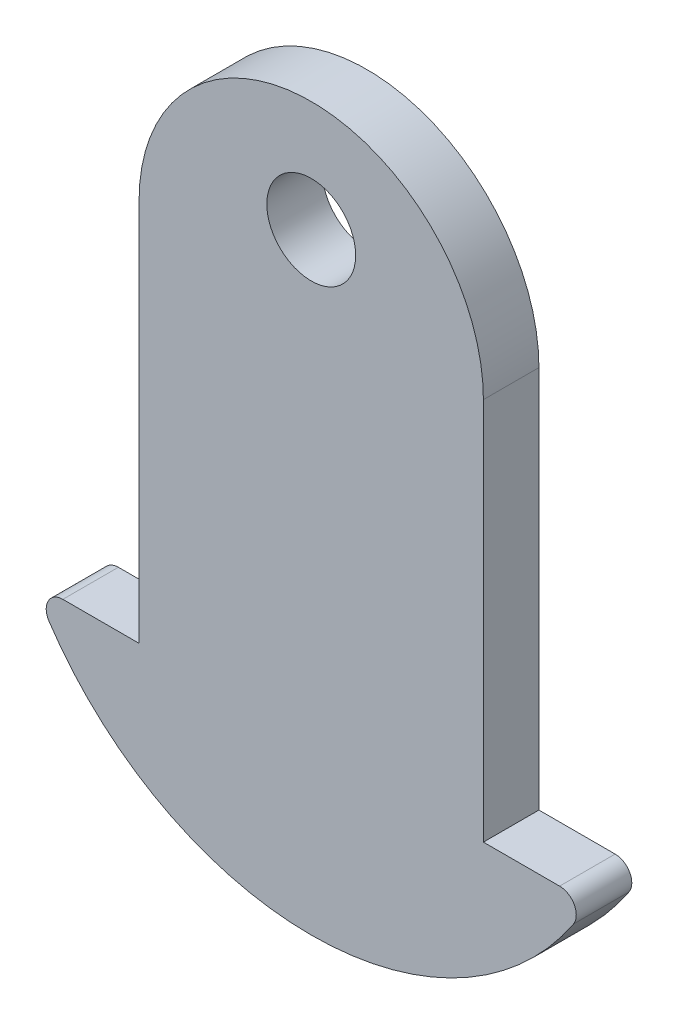
ISO-10303-21;
HEADER;
FILE_DESCRIPTION(('STEP AP214'),'2;1');
FILE_NAME('part.step','',(''),(''),'','','');
FILE_SCHEMA(('AUTOMOTIVE_DESIGN { 1 0 10303 214 1 1 1 1 }'));
ENDSEC;
DATA;
#1=APPLICATION_CONTEXT('core data for automotive mechanical design processes');
#2=APPLICATION_PROTOCOL_DEFINITION('international standard','automotive_design',2000,#1);
#3=PRODUCT_CONTEXT('',#1,'mechanical');
#4=PRODUCT('Part','Part','',(#3));
#5=PRODUCT_RELATED_PRODUCT_CATEGORY('part','',(#4));
#6=PRODUCT_DEFINITION_FORMATION('','',#4);
#7=PRODUCT_DEFINITION_CONTEXT('part definition',#1,'design');
#8=PRODUCT_DEFINITION('design','',#6,#7);
#9=PRODUCT_DEFINITION_SHAPE('','',#8);
#10=(LENGTH_UNIT() NAMED_UNIT(*) SI_UNIT(.MILLI.,.METRE.));
#11=(NAMED_UNIT(*) PLANE_ANGLE_UNIT() SI_UNIT($,.RADIAN.));
#12=(NAMED_UNIT(*) SI_UNIT($,.STERADIAN.) SOLID_ANGLE_UNIT());
#13=UNCERTAINTY_MEASURE_WITH_UNIT(LENGTH_MEASURE(1.E-05),#10,'distance_accuracy_value','');
#14=(GEOMETRIC_REPRESENTATION_CONTEXT(3) GLOBAL_UNCERTAINTY_ASSIGNED_CONTEXT((#13)) GLOBAL_UNIT_ASSIGNED_CONTEXT((#10,
#11,#12)) REPRESENTATION_CONTEXT('',''));
#15=CARTESIAN_POINT('',(0.,0.,0.));
#16=DIRECTION('',(0.,0.,1.));
#17=DIRECTION('',(1.,0.,0.));
#18=AXIS2_PLACEMENT_3D('',#15,#16,#17);
#19=CARTESIAN_POINT('',(0.,17.25,1.25));
#20=DIRECTION('',(0.,0.,1.));
#21=DIRECTION('',(1.,0.,0.));
#22=AXIS2_PLACEMENT_3D('',#19,#20,#21);
#23=PLANE('',#22);
#24=DIRECTION('',(-1.,0.,0.));
#25=VECTOR('',#24,1.);
#26=CARTESIAN_POINT('',(-7.75,0.,1.25));
#27=LINE('',#26,#25);
#28=CARTESIAN_POINT('',(-7.75,0.,1.25));
#29=VERTEX_POINT('',#28);
#30=CARTESIAN_POINT('',(-11.1803398874989,0.,1.25));
#31=VERTEX_POINT('',#30);
#32=EDGE_CURVE('E108',#29,#31,#27,.T.);
#33=ORIENTED_EDGE('',*,*,#32,.T.);
#34=CARTESIAN_POINT('',(-11.1803398874989,-0.75,1.25));
#35=DIRECTION('',(0.,0.,1.));
#36=DIRECTION('',(1.,0.,0.));
#37=AXIS2_PLACEMENT_3D('',#34,#35,#36);
#38=CIRCLE('',#37,0.75);
#39=CARTESIAN_POINT('',(-11.8053278315206,-1.16459627329193,1.25));
#40=VERTEX_POINT('',#39);
#41=EDGE_CURVE('E40',#31,#40,#38,.T.);
#42=ORIENTED_EDGE('',*,*,#41,.T.);
#43=CARTESIAN_POINT('',(0.,6.66666666666667,1.25));
#44=DIRECTION('',(0.,0.,1.));
#45=DIRECTION('',(-1.,0.,0.));
#46=AXIS2_PLACEMENT_3D('',#43,#44,#45);
#47=CIRCLE('',#46,14.1666666666667);
#48=CARTESIAN_POINT('',(11.8053278315206,-1.16459627329193,1.25));
#49=VERTEX_POINT('',#48);
#50=EDGE_CURVE('E140',#40,#49,#47,.T.);
#51=ORIENTED_EDGE('',*,*,#50,.T.);
#52=CARTESIAN_POINT('',(11.1803398874989,-0.75,1.25));
#53=DIRECTION('',(0.,0.,1.));
#54=DIRECTION('',(1.,0.,0.));
#55=AXIS2_PLACEMENT_3D('',#52,#53,#54);
#56=CIRCLE('',#55,0.75);
#57=CARTESIAN_POINT('',(11.1803398874989,0.,1.25));
#58=VERTEX_POINT('',#57);
#59=EDGE_CURVE('E47',#49,#58,#56,.T.);
#60=ORIENTED_EDGE('',*,*,#59,.T.);
#61=DIRECTION('',(-1.,0.,0.));
#62=VECTOR('',#61,1.);
#63=CARTESIAN_POINT('',(7.75,0.,1.25));
#64=LINE('',#63,#62);
#65=CARTESIAN_POINT('',(7.75,0.,1.25));
#66=VERTEX_POINT('',#65);
#67=EDGE_CURVE('E148',#58,#66,#64,.T.);
#68=ORIENTED_EDGE('',*,*,#67,.T.);
#69=DIRECTION('',(0.,1.,0.));
#70=VECTOR('',#69,1.);
#71=CARTESIAN_POINT('',(7.75,17.25,1.25));
#72=LINE('',#71,#70);
#73=CARTESIAN_POINT('',(7.75,17.25,1.25));
#74=VERTEX_POINT('',#73);
#75=EDGE_CURVE('E114',#66,#74,#72,.T.);
#76=ORIENTED_EDGE('',*,*,#75,.T.);
#77=CARTESIAN_POINT('',(0.,17.25,1.25));
#78=DIRECTION('',(0.,0.,1.));
#79=DIRECTION('',(1.,0.,0.));
#80=AXIS2_PLACEMENT_3D('',#77,#78,#79);
#81=CIRCLE('',#80,7.75);
#82=CARTESIAN_POINT('',(-7.75,17.25,1.25));
#83=VERTEX_POINT('',#82);
#84=EDGE_CURVE('E109',#74,#83,#81,.T.);
#85=ORIENTED_EDGE('',*,*,#84,.T.);
#86=DIRECTION('',(0.,-1.,0.));
#87=VECTOR('',#86,1.);
#88=CARTESIAN_POINT('',(-7.75,17.25,1.25));
#89=LINE('',#88,#87);
#90=EDGE_CURVE('E100',#83,#29,#89,.T.);
#91=ORIENTED_EDGE('',*,*,#90,.T.);
#92=EDGE_LOOP('',(#33,#42,#51,#60,#68,#76,#85,#91));
#93=FACE_BOUND('',#92,.T.);
#94=CARTESIAN_POINT('',(0.,20.,1.25));
#95=DIRECTION('',(0.,0.,1.));
#96=DIRECTION('',(1.,0.,0.));
#97=AXIS2_PLACEMENT_3D('',#94,#95,#96);
#98=CIRCLE('',#97,2.);
#99=CARTESIAN_POINT('',(2.,20.,1.25));
#100=VERTEX_POINT('',#99);
#101=EDGE_CURVE('E175',#100,#100,#98,.T.);
#102=ORIENTED_EDGE('',*,*,#101,.F.);
#103=EDGE_LOOP('',(#102));
#104=FACE_BOUND('',#103,.T.);
#105=ADVANCED_FACE('F32',(#93,#104),#23,.T.);
#106=CARTESIAN_POINT('',(0.,17.25,-1.25));
#107=DIRECTION('',(0.,0.,1.));
#108=DIRECTION('',(1.,0.,0.));
#109=AXIS2_PLACEMENT_3D('',#106,#107,#108);
#110=PLANE('',#109);
#111=CARTESIAN_POINT('',(0.,6.66666666666667,-1.25));
#112=DIRECTION('',(0.,0.,1.));
#113=DIRECTION('',(-1.,0.,0.));
#114=AXIS2_PLACEMENT_3D('',#111,#112,#113);
#115=CIRCLE('',#114,14.1666666666667);
#116=CARTESIAN_POINT('',(-11.8053278315206,-1.16459627329193,-1.25));
#117=VERTEX_POINT('',#116);
#118=CARTESIAN_POINT('',(11.8053278315206,-1.16459627329193,-1.25));
#119=VERTEX_POINT('',#118);
#120=EDGE_CURVE('E156',#117,#119,#115,.T.);
#121=ORIENTED_EDGE('',*,*,#120,.F.);
#122=CARTESIAN_POINT('',(-11.1803398874989,-0.75,-1.25));
#123=DIRECTION('',(0.,0.,1.));
#124=DIRECTION('',(1.,0.,0.));
#125=AXIS2_PLACEMENT_3D('',#122,#123,#124);
#126=CIRCLE('',#125,0.75);
#127=CARTESIAN_POINT('',(-11.1803398874989,0.,-1.25));
#128=VERTEX_POINT('',#127);
#129=EDGE_CURVE('E135',#117,#128,#126,.F.);
#130=ORIENTED_EDGE('',*,*,#129,.T.);
#131=DIRECTION('',(-1.,0.,0.));
#132=VECTOR('',#131,1.);
#133=CARTESIAN_POINT('',(-7.75,0.,-1.25));
#134=LINE('',#133,#132);
#135=CARTESIAN_POINT('',(-7.75,0.,-1.25));
#136=VERTEX_POINT('',#135);
#137=EDGE_CURVE('E155',#136,#128,#134,.T.);
#138=ORIENTED_EDGE('',*,*,#137,.F.);
#139=DIRECTION('',(0.,-1.,0.));
#140=VECTOR('',#139,1.);
#141=CARTESIAN_POINT('',(-7.75,17.25,-1.25));
#142=LINE('',#141,#140);
#143=CARTESIAN_POINT('',(-7.75,17.25,-1.25));
#144=VERTEX_POINT('',#143);
#145=EDGE_CURVE('E158',#144,#136,#142,.T.);
#146=ORIENTED_EDGE('',*,*,#145,.F.);
#147=CARTESIAN_POINT('',(0.,17.25,-1.25));
#148=DIRECTION('',(0.,0.,1.));
#149=DIRECTION('',(1.,0.,0.));
#150=AXIS2_PLACEMENT_3D('',#147,#148,#149);
#151=CIRCLE('',#150,7.75);
#152=CARTESIAN_POINT('',(7.75,17.25,-1.25));
#153=VERTEX_POINT('',#152);
#154=EDGE_CURVE('E122',#153,#144,#151,.T.);
#155=ORIENTED_EDGE('',*,*,#154,.F.);
#156=DIRECTION('',(0.,1.,0.));
#157=VECTOR('',#156,1.);
#158=CARTESIAN_POINT('',(7.75,17.25,-1.25));
#159=LINE('',#158,#157);
#160=CARTESIAN_POINT('',(7.75,0.,-1.25));
#161=VERTEX_POINT('',#160);
#162=EDGE_CURVE('E118',#161,#153,#159,.T.);
#163=ORIENTED_EDGE('',*,*,#162,.F.);
#164=DIRECTION('',(-1.,0.,0.));
#165=VECTOR('',#164,1.);
#166=CARTESIAN_POINT('',(7.75,0.,-1.25));
#167=LINE('',#166,#165);
#168=CARTESIAN_POINT('',(11.1803398874989,0.,-1.25));
#169=VERTEX_POINT('',#168);
#170=EDGE_CURVE('E160',#169,#161,#167,.T.);
#171=ORIENTED_EDGE('',*,*,#170,.F.);
#172=CARTESIAN_POINT('',(11.1803398874989,-0.75,-1.25));
#173=DIRECTION('',(0.,0.,1.));
#174=DIRECTION('',(1.,0.,0.));
#175=AXIS2_PLACEMENT_3D('',#172,#173,#174);
#176=CIRCLE('',#175,0.75);
#177=EDGE_CURVE('E133',#169,#119,#176,.F.);
#178=ORIENTED_EDGE('',*,*,#177,.T.);
#179=EDGE_LOOP('',(#121,#130,#138,#146,#155,#163,#171,#178));
#180=FACE_BOUND('',#179,.T.);
#181=CARTESIAN_POINT('',(0.,20.,-1.25));
#182=DIRECTION('',(0.,0.,1.));
#183=DIRECTION('',(1.,0.,0.));
#184=AXIS2_PLACEMENT_3D('',#181,#182,#183);
#185=CIRCLE('',#184,2.);
#186=CARTESIAN_POINT('',(2.,20.,-1.25));
#187=VERTEX_POINT('',#186);
#188=EDGE_CURVE('E177',#187,#187,#185,.T.);
#189=ORIENTED_EDGE('',*,*,#188,.T.);
#190=EDGE_LOOP('',(#189));
#191=FACE_BOUND('',#190,.T.);
#192=ADVANCED_FACE('F153',(#180,#191),#110,.F.);
#193=CARTESIAN_POINT('',(0.,17.25,1.25));
#194=DIRECTION('',(0.,0.,-1.));
#195=DIRECTION('',(-1.,0.,0.));
#196=AXIS2_PLACEMENT_3D('',#193,#194,#195);
#197=CYLINDRICAL_SURFACE('',#196,7.75);
#198=ORIENTED_EDGE('',*,*,#154,.T.);
#199=DIRECTION('',(0.,0.,-1.));
#200=VECTOR('',#199,1.);
#201=CARTESIAN_POINT('',(-7.75,17.25,1.25));
#202=LINE('',#201,#200);
#203=EDGE_CURVE('E104',#83,#144,#202,.T.);
#204=ORIENTED_EDGE('',*,*,#203,.F.);
#205=ORIENTED_EDGE('',*,*,#84,.F.);
#206=DIRECTION('',(0.,0.,-1.));
#207=VECTOR('',#206,1.);
#208=CARTESIAN_POINT('',(7.75,17.25,1.25));
#209=LINE('',#208,#207);
#210=EDGE_CURVE('E167',#74,#153,#209,.T.);
#211=ORIENTED_EDGE('',*,*,#210,.T.);
#212=EDGE_LOOP('',(#198,#204,#205,#211));
#213=FACE_BOUND('',#212,.T.);
#214=ADVANCED_FACE('F120',(#213),#197,.T.);
#215=CARTESIAN_POINT('',(-7.75,17.25,1.25));
#216=DIRECTION('',(1.,0.,0.));
#217=DIRECTION('',(0.,1.,0.));
#218=AXIS2_PLACEMENT_3D('',#215,#216,#217);
#219=PLANE('',#218);
#220=ORIENTED_EDGE('',*,*,#145,.T.);
#221=DIRECTION('',(0.,0.,-1.));
#222=VECTOR('',#221,1.);
#223=CARTESIAN_POINT('',(-7.75,0.,1.25));
#224=LINE('',#223,#222);
#225=EDGE_CURVE('E107',#29,#136,#224,.T.);
#226=ORIENTED_EDGE('',*,*,#225,.F.);
#227=ORIENTED_EDGE('',*,*,#90,.F.);
#228=ORIENTED_EDGE('',*,*,#203,.T.);
#229=EDGE_LOOP('',(#220,#226,#227,#228));
#230=FACE_BOUND('',#229,.T.);
#231=ADVANCED_FACE('F102',(#230),#219,.F.);
#232=CARTESIAN_POINT('',(-7.75,0.,1.25));
#233=DIRECTION('',(0.,-1.,0.));
#234=DIRECTION('',(1.,0.,0.));
#235=AXIS2_PLACEMENT_3D('',#232,#233,#234);
#236=PLANE('',#235);
#237=ORIENTED_EDGE('',*,*,#137,.T.);
#238=DIRECTION('',(0.,0.,-1.));
#239=VECTOR('',#238,1.);
#240=CARTESIAN_POINT('',(-11.1803398874989,0.,1.25));
#241=LINE('',#240,#239);
#242=EDGE_CURVE('E55',#128,#31,#241,.F.);
#243=ORIENTED_EDGE('',*,*,#242,.T.);
#244=ORIENTED_EDGE('',*,*,#32,.F.);
#245=ORIENTED_EDGE('',*,*,#225,.T.);
#246=EDGE_LOOP('',(#237,#243,#244,#245));
#247=FACE_BOUND('',#246,.T.);
#248=ADVANCED_FACE('F157',(#247),#236,.F.);
#249=CARTESIAN_POINT('',(0.,6.66666666666667,1.25));
#250=DIRECTION('',(0.,0.,-1.));
#251=DIRECTION('',(-1.,0.,0.));
#252=AXIS2_PLACEMENT_3D('',#249,#250,#251);
#253=CYLINDRICAL_SURFACE('',#252,14.1666666666667);
#254=ORIENTED_EDGE('',*,*,#50,.F.);
#255=DIRECTION('',(0.,0.,-1.));
#256=VECTOR('',#255,1.);
#257=CARTESIAN_POINT('',(-11.8053278315206,-1.16459627329193,1.25));
#258=LINE('',#257,#256);
#259=EDGE_CURVE('E125',#40,#117,#258,.T.);
#260=ORIENTED_EDGE('',*,*,#259,.T.);
#261=ORIENTED_EDGE('',*,*,#120,.T.);
#262=DIRECTION('',(0.,0.,-1.));
#263=VECTOR('',#262,1.);
#264=CARTESIAN_POINT('',(11.8053278315206,-1.16459627329193,1.25));
#265=LINE('',#264,#263);
#266=EDGE_CURVE('E123',#119,#49,#265,.F.);
#267=ORIENTED_EDGE('',*,*,#266,.T.);
#268=EDGE_LOOP('',(#254,#260,#261,#267));
#269=FACE_BOUND('',#268,.T.);
#270=ADVANCED_FACE('F144',(#269),#253,.T.);
#271=CARTESIAN_POINT('',(7.75,0.,1.25));
#272=DIRECTION('',(0.,-1.,0.));
#273=DIRECTION('',(1.,0.,0.));
#274=AXIS2_PLACEMENT_3D('',#271,#272,#273);
#275=PLANE('',#274);
#276=ORIENTED_EDGE('',*,*,#67,.F.);
#277=DIRECTION('',(0.,0.,-1.));
#278=VECTOR('',#277,1.);
#279=CARTESIAN_POINT('',(11.1803398874989,0.,1.25));
#280=LINE('',#279,#278);
#281=EDGE_CURVE('E11',#58,#169,#280,.T.);
#282=ORIENTED_EDGE('',*,*,#281,.T.);
#283=ORIENTED_EDGE('',*,*,#170,.T.);
#284=DIRECTION('',(0.,0.,-1.));
#285=VECTOR('',#284,1.);
#286=CARTESIAN_POINT('',(7.75,0.,1.25));
#287=LINE('',#286,#285);
#288=EDGE_CURVE('E127',#66,#161,#287,.T.);
#289=ORIENTED_EDGE('',*,*,#288,.F.);
#290=EDGE_LOOP('',(#276,#282,#283,#289));
#291=FACE_BOUND('',#290,.T.);
#292=ADVANCED_FACE('F194',(#291),#275,.F.);
#293=CARTESIAN_POINT('',(7.75,17.25,1.25));
#294=DIRECTION('',(-1.,0.,0.));
#295=DIRECTION('',(0.,-1.,0.));
#296=AXIS2_PLACEMENT_3D('',#293,#294,#295);
#297=PLANE('',#296);
#298=ORIENTED_EDGE('',*,*,#162,.T.);
#299=ORIENTED_EDGE('',*,*,#210,.F.);
#300=ORIENTED_EDGE('',*,*,#75,.F.);
#301=ORIENTED_EDGE('',*,*,#288,.T.);
#302=EDGE_LOOP('',(#298,#299,#300,#301));
#303=FACE_BOUND('',#302,.T.);
#304=ADVANCED_FACE('F172',(#303),#297,.F.);
#305=CARTESIAN_POINT('',(0.,20.,1.25));
#306=DIRECTION('',(0.,0.,-1.));
#307=DIRECTION('',(-1.,0.,0.));
#308=AXIS2_PLACEMENT_3D('',#305,#306,#307);
#309=CYLINDRICAL_SURFACE('',#308,2.);
#310=ORIENTED_EDGE('',*,*,#101,.T.);
#311=EDGE_LOOP('',(#310));
#312=FACE_BOUND('',#311,.T.);
#313=ORIENTED_EDGE('',*,*,#188,.F.);
#314=EDGE_LOOP('',(#313));
#315=FACE_BOUND('',#314,.T.);
#316=ADVANCED_FACE('F186',(#312,#315),#309,.F.);
#317=CARTESIAN_POINT('',(-11.1803398874989,-0.75,1.25));
#318=DIRECTION('',(0.,0.,-1.));
#319=DIRECTION('',(-1.,0.,0.));
#320=AXIS2_PLACEMENT_3D('',#317,#318,#319);
#321=CYLINDRICAL_SURFACE('',#320,0.75);
#322=ORIENTED_EDGE('',*,*,#41,.F.);
#323=ORIENTED_EDGE('',*,*,#242,.F.);
#324=ORIENTED_EDGE('',*,*,#129,.F.);
#325=ORIENTED_EDGE('',*,*,#259,.F.);
#326=EDGE_LOOP('',(#322,#323,#324,#325));
#327=FACE_BOUND('',#326,.T.);
#328=ADVANCED_FACE('F150',(#327),#321,.T.);
#329=CARTESIAN_POINT('',(11.1803398874989,-0.75,1.25));
#330=DIRECTION('',(0.,0.,-1.));
#331=DIRECTION('',(-1.,0.,0.));
#332=AXIS2_PLACEMENT_3D('',#329,#330,#331);
#333=CYLINDRICAL_SURFACE('',#332,0.75);
#334=ORIENTED_EDGE('',*,*,#59,.F.);
#335=ORIENTED_EDGE('',*,*,#266,.F.);
#336=ORIENTED_EDGE('',*,*,#177,.F.);
#337=ORIENTED_EDGE('',*,*,#281,.F.);
#338=EDGE_LOOP('',(#334,#335,#336,#337));
#339=FACE_BOUND('',#338,.T.);
#340=ADVANCED_FACE('F34',(#339),#333,.T.);
#341=CLOSED_SHELL('',(#105,#192,#214,#231,#248,#270,#292,#304,#316,#328,#340));
#342=MANIFOLD_SOLID_BREP('B2',#341);
#343=ADVANCED_BREP_SHAPE_REPRESENTATION('',(#18,#342),#14);
#344=SHAPE_DEFINITION_REPRESENTATION(#9,#343);
ENDSEC;
END-ISO-10303-21;
